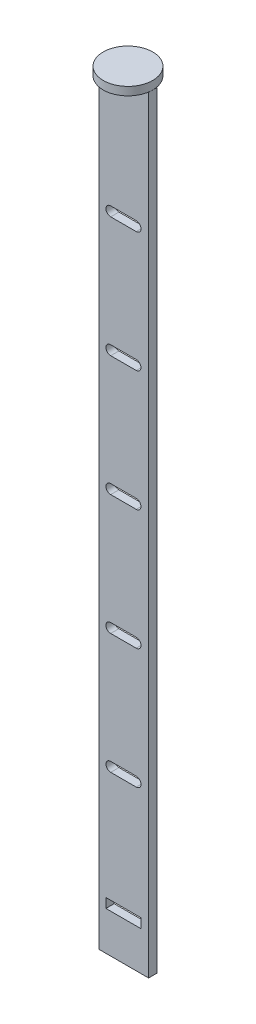
ISO-10303-21;
HEADER;
FILE_DESCRIPTION(('STEP AP214'),'2;1');
FILE_NAME('part.step','',(''),(''),'','','');
FILE_SCHEMA(('AUTOMOTIVE_DESIGN { 1 0 10303 214 1 1 1 1 }'));
ENDSEC;
DATA;
#1=APPLICATION_CONTEXT('core data for automotive mechanical design processes');
#2=APPLICATION_PROTOCOL_DEFINITION('international standard','automotive_design',2000,#1);
#3=PRODUCT_CONTEXT('',#1,'mechanical');
#4=PRODUCT('Part','Part','',(#3));
#5=PRODUCT_RELATED_PRODUCT_CATEGORY('part','',(#4));
#6=PRODUCT_DEFINITION_FORMATION('','',#4);
#7=PRODUCT_DEFINITION_CONTEXT('part definition',#1,'design');
#8=PRODUCT_DEFINITION('design','',#6,#7);
#9=PRODUCT_DEFINITION_SHAPE('','',#8);
#10=(LENGTH_UNIT() NAMED_UNIT(*) SI_UNIT(.MILLI.,.METRE.));
#11=(NAMED_UNIT(*) PLANE_ANGLE_UNIT() SI_UNIT($,.RADIAN.));
#12=(NAMED_UNIT(*) SI_UNIT($,.STERADIAN.) SOLID_ANGLE_UNIT());
#13=UNCERTAINTY_MEASURE_WITH_UNIT(LENGTH_MEASURE(1.E-05),#10,'distance_accuracy_value','');
#14=(GEOMETRIC_REPRESENTATION_CONTEXT(3) GLOBAL_UNCERTAINTY_ASSIGNED_CONTEXT((#13)) GLOBAL_UNIT_ASSIGNED_CONTEXT((#10,
#11,#12)) REPRESENTATION_CONTEXT('',''));
#15=CARTESIAN_POINT('',(0.,0.,0.));
#16=DIRECTION('',(0.,0.,1.));
#17=DIRECTION('',(1.,0.,0.));
#18=AXIS2_PLACEMENT_3D('',#15,#16,#17);
#19=CARTESIAN_POINT('',(29.,404.,498.));
#20=DIRECTION('',(0.,-1.,0.));
#21=DIRECTION('',(0.,0.,-1.));
#22=AXIS2_PLACEMENT_3D('',#19,#20,#21);
#23=CYLINDRICAL_SURFACE('',#22,12.);
#24=CARTESIAN_POINT('',(29.,404.,498.));
#25=DIRECTION('',(0.,1.,0.));
#26=DIRECTION('',(0.,0.,1.));
#27=AXIS2_PLACEMENT_3D('',#24,#25,#26);
#28=CIRCLE('',#27,12.);
#29=CARTESIAN_POINT('',(29.,404.,510.));
#30=VERTEX_POINT('',#29);
#31=EDGE_CURVE('E11',#30,#30,#28,.T.);
#32=ORIENTED_EDGE('',*,*,#31,.F.);
#33=EDGE_LOOP('',(#32));
#34=FACE_BOUND('',#33,.T.);
#35=CARTESIAN_POINT('',(29.,400.,498.));
#36=DIRECTION('',(0.,1.,0.));
#37=DIRECTION('',(0.,0.,1.));
#38=AXIS2_PLACEMENT_3D('',#35,#36,#37);
#39=CIRCLE('',#38,12.);
#40=CARTESIAN_POINT('',(29.,400.,510.));
#41=VERTEX_POINT('',#40);
#42=EDGE_CURVE('E52',#41,#41,#39,.T.);
#43=ORIENTED_EDGE('',*,*,#42,.T.);
#44=EDGE_LOOP('',(#43));
#45=FACE_BOUND('',#44,.T.);
#46=ADVANCED_FACE('F49',(#34,#45),#23,.T.);
#47=CARTESIAN_POINT('',(29.,404.,498.));
#48=DIRECTION('',(0.,1.,0.));
#49=DIRECTION('',(0.,0.,1.));
#50=AXIS2_PLACEMENT_3D('',#47,#48,#49);
#51=PLANE('',#50);
#52=ORIENTED_EDGE('',*,*,#31,.T.);
#53=EDGE_LOOP('',(#52));
#54=FACE_BOUND('',#53,.T.);
#55=ADVANCED_FACE('F64',(#54),#51,.T.);
#56=CARTESIAN_POINT('',(29.,400.,498.));
#57=DIRECTION('',(0.,1.,0.));
#58=DIRECTION('',(0.,0.,1.));
#59=AXIS2_PLACEMENT_3D('',#56,#57,#58);
#60=PLANE('',#59);
#61=ORIENTED_EDGE('',*,*,#42,.F.);
#62=EDGE_LOOP('',(#61));
#63=FACE_BOUND('',#62,.T.);
#64=ADVANCED_FACE('F62',(#63),#60,.F.);
#65=CLOSED_SHELL('',(#46,#55,#64));
#66=MANIFOLD_SOLID_BREP('B2',#65);
#67=CARTESIAN_POINT('',(41.,28.,500.));
#68=DIRECTION('',(0.,0.,-1.));
#69=DIRECTION('',(-1.,0.,0.));
#70=AXIS2_PLACEMENT_3D('',#67,#68,#69);
#71=PLANE('',#70);
#72=DIRECTION('',(-1.,0.,0.));
#73=VECTOR('',#72,1.);
#74=CARTESIAN_POINT('',(22.6047226650039,284.8,500.));
#75=LINE('',#74,#73);
#76=CARTESIAN_POINT('',(35.,284.8,500.));
#77=VERTEX_POINT('',#76);
#78=CARTESIAN_POINT('',(22.6047226650039,284.8,500.));
#79=VERTEX_POINT('',#78);
#80=EDGE_CURVE('E301',#77,#79,#75,.T.);
#81=ORIENTED_EDGE('',*,*,#80,.F.);
#82=CARTESIAN_POINT('',(35.,282.5,500.));
#83=DIRECTION('',(0.,0.,-1.));
#84=DIRECTION('',(-1.,0.,0.));
#85=AXIS2_PLACEMENT_3D('',#82,#83,#84);
#86=CIRCLE('',#85,2.3);
#87=CARTESIAN_POINT('',(35.,280.2,500.));
#88=VERTEX_POINT('',#87);
#89=EDGE_CURVE('E320',#88,#77,#86,.F.);
#90=ORIENTED_EDGE('',*,*,#89,.F.);
#91=DIRECTION('',(1.,0.,0.));
#92=VECTOR('',#91,1.);
#93=CARTESIAN_POINT('',(22.6047226650039,280.2,500.));
#94=LINE('',#93,#92);
#95=CARTESIAN_POINT('',(22.6047226650039,280.2,500.));
#96=VERTEX_POINT('',#95);
#97=EDGE_CURVE('E303',#96,#88,#94,.T.);
#98=ORIENTED_EDGE('',*,*,#97,.F.);
#99=CARTESIAN_POINT('',(22.604722665004,282.5,500.));
#100=DIRECTION('',(0.,0.,-1.));
#101=DIRECTION('',(-1.,0.,0.));
#102=AXIS2_PLACEMENT_3D('',#99,#100,#101);
#103=CIRCLE('',#102,2.3);
#104=EDGE_CURVE('E324',#79,#96,#103,.F.);
#105=ORIENTED_EDGE('',*,*,#104,.F.);
#106=EDGE_LOOP('',(#81,#90,#98,#105));
#107=FACE_BOUND('',#106,.T.);
#108=DIRECTION('',(-1.,0.,0.));
#109=VECTOR('',#108,1.);
#110=CARTESIAN_POINT('',(22.6047226650039,168.133333333333,500.));
#111=LINE('',#110,#109);
#112=CARTESIAN_POINT('',(35.,168.133333333333,500.));
#113=VERTEX_POINT('',#112);
#114=CARTESIAN_POINT('',(22.6047226650039,168.133333333333,500.));
#115=VERTEX_POINT('',#114);
#116=EDGE_CURVE('E353',#113,#115,#111,.T.);
#117=ORIENTED_EDGE('',*,*,#116,.F.);
#118=CARTESIAN_POINT('',(35.,165.833333333333,500.));
#119=DIRECTION('',(0.,0.,-1.));
#120=DIRECTION('',(-1.,0.,0.));
#121=AXIS2_PLACEMENT_3D('',#118,#119,#120);
#122=CIRCLE('',#121,2.3);
#123=CARTESIAN_POINT('',(35.,163.533333333333,500.));
#124=VERTEX_POINT('',#123);
#125=EDGE_CURVE('E372',#124,#113,#122,.F.);
#126=ORIENTED_EDGE('',*,*,#125,.F.);
#127=DIRECTION('',(1.,0.,0.));
#128=VECTOR('',#127,1.);
#129=CARTESIAN_POINT('',(22.6047226650039,163.533333333333,500.));
#130=LINE('',#129,#128);
#131=CARTESIAN_POINT('',(22.6047226650039,163.533333333333,500.));
#132=VERTEX_POINT('',#131);
#133=EDGE_CURVE('E355',#132,#124,#130,.T.);
#134=ORIENTED_EDGE('',*,*,#133,.F.);
#135=CARTESIAN_POINT('',(22.604722665004,165.833333333333,500.));
#136=DIRECTION('',(0.,0.,-1.));
#137=DIRECTION('',(-1.,0.,0.));
#138=AXIS2_PLACEMENT_3D('',#135,#136,#137);
#139=CIRCLE('',#138,2.3);
#140=EDGE_CURVE('E376',#115,#132,#139,.F.);
#141=ORIENTED_EDGE('',*,*,#140,.F.);
#142=EDGE_LOOP('',(#117,#126,#134,#141));
#143=FACE_BOUND('',#142,.T.);
#144=DIRECTION('',(0.,-1.,0.));
#145=VECTOR('',#144,1.);
#146=CARTESIAN_POINT('',(17.,28.,500.));
#147=LINE('',#146,#145);
#148=CARTESIAN_POINT('',(17.,400.,500.));
#149=VERTEX_POINT('',#148);
#150=CARTESIAN_POINT('',(17.,28.,500.));
#151=VERTEX_POINT('',#150);
#152=EDGE_CURVE('E425',#149,#151,#147,.T.);
#153=ORIENTED_EDGE('',*,*,#152,.T.);
#154=DIRECTION('',(-1.,0.,0.));
#155=VECTOR('',#154,1.);
#156=CARTESIAN_POINT('',(41.,28.,500.));
#157=LINE('',#156,#155);
#158=CARTESIAN_POINT('',(41.,28.,500.));
#159=VERTEX_POINT('',#158);
#160=EDGE_CURVE('E452',#159,#151,#157,.T.);
#161=ORIENTED_EDGE('',*,*,#160,.F.);
#162=DIRECTION('',(0.,-1.,0.));
#163=VECTOR('',#162,1.);
#164=CARTESIAN_POINT('',(41.,28.,500.));
#165=LINE('',#164,#163);
#166=CARTESIAN_POINT('',(41.,400.,500.));
#167=VERTEX_POINT('',#166);
#168=EDGE_CURVE('E426',#167,#159,#165,.T.);
#169=ORIENTED_EDGE('',*,*,#168,.F.);
#170=DIRECTION('',(-1.,0.,0.));
#171=VECTOR('',#170,1.);
#172=CARTESIAN_POINT('',(41.,400.,500.));
#173=LINE('',#172,#171);
#174=EDGE_CURVE('E436',#167,#149,#173,.T.);
#175=ORIENTED_EDGE('',*,*,#174,.T.);
#176=EDGE_LOOP('',(#153,#161,#169,#175));
#177=FACE_BOUND('',#176,.T.);
#178=DIRECTION('',(-1.,0.,0.));
#179=VECTOR('',#178,1.);
#180=CARTESIAN_POINT('',(41.,51.4666666666667,500.));
#181=LINE('',#180,#179);
#182=CARTESIAN_POINT('',(37.3,51.4666666666667,500.));
#183=VERTEX_POINT('',#182);
#184=CARTESIAN_POINT('',(20.304722665004,51.4666666666667,500.));
#185=VERTEX_POINT('',#184);
#186=EDGE_CURVE('E420',#183,#185,#181,.T.);
#187=ORIENTED_EDGE('',*,*,#186,.F.);
#188=DIRECTION('',(0.,-1.,0.));
#189=VECTOR('',#188,1.);
#190=CARTESIAN_POINT('',(37.3,28.,500.));
#191=LINE('',#190,#189);
#192=CARTESIAN_POINT('',(37.3,46.8666666666667,500.));
#193=VERTEX_POINT('',#192);
#194=EDGE_CURVE('E417',#183,#193,#191,.T.);
#195=ORIENTED_EDGE('',*,*,#194,.T.);
#196=DIRECTION('',(1.,0.,0.));
#197=VECTOR('',#196,1.);
#198=CARTESIAN_POINT('',(41.,46.8666666666667,500.));
#199=LINE('',#198,#197);
#200=CARTESIAN_POINT('',(20.304722665004,46.8666666666667,500.));
#201=VERTEX_POINT('',#200);
#202=EDGE_CURVE('E423',#201,#193,#199,.T.);
#203=ORIENTED_EDGE('',*,*,#202,.F.);
#204=DIRECTION('',(0.,-1.,0.));
#205=VECTOR('',#204,1.);
#206=CARTESIAN_POINT('',(20.304722665004,28.,500.));
#207=LINE('',#206,#205);
#208=EDGE_CURVE('E413',#185,#201,#207,.T.);
#209=ORIENTED_EDGE('',*,*,#208,.F.);
#210=EDGE_LOOP('',(#187,#195,#203,#209));
#211=FACE_BOUND('',#210,.T.);
#212=DIRECTION('',(-1.,0.,0.));
#213=VECTOR('',#212,1.);
#214=CARTESIAN_POINT('',(22.6047226650039,109.8,500.));
#215=LINE('',#214,#213);
#216=CARTESIAN_POINT('',(35.,109.8,500.));
#217=VERTEX_POINT('',#216);
#218=CARTESIAN_POINT('',(22.6047226650039,109.8,500.));
#219=VERTEX_POINT('',#218);
#220=EDGE_CURVE('E379',#217,#219,#215,.T.);
#221=ORIENTED_EDGE('',*,*,#220,.F.);
#222=CARTESIAN_POINT('',(35.,107.5,500.));
#223=DIRECTION('',(0.,0.,-1.));
#224=DIRECTION('',(-1.,0.,0.));
#225=AXIS2_PLACEMENT_3D('',#222,#223,#224);
#226=CIRCLE('',#225,2.3);
#227=CARTESIAN_POINT('',(35.,105.2,500.));
#228=VERTEX_POINT('',#227);
#229=EDGE_CURVE('E398',#228,#217,#226,.F.);
#230=ORIENTED_EDGE('',*,*,#229,.F.);
#231=DIRECTION('',(1.,0.,0.));
#232=VECTOR('',#231,1.);
#233=CARTESIAN_POINT('',(22.6047226650039,105.2,500.));
#234=LINE('',#233,#232);
#235=CARTESIAN_POINT('',(22.6047226650039,105.2,500.));
#236=VERTEX_POINT('',#235);
#237=EDGE_CURVE('E381',#236,#228,#234,.T.);
#238=ORIENTED_EDGE('',*,*,#237,.F.);
#239=CARTESIAN_POINT('',(22.604722665004,107.5,500.));
#240=DIRECTION('',(0.,0.,-1.));
#241=DIRECTION('',(-1.,0.,0.));
#242=AXIS2_PLACEMENT_3D('',#239,#240,#241);
#243=CIRCLE('',#242,2.3);
#244=EDGE_CURVE('E402',#219,#236,#243,.F.);
#245=ORIENTED_EDGE('',*,*,#244,.F.);
#246=EDGE_LOOP('',(#221,#230,#238,#245));
#247=FACE_BOUND('',#246,.T.);
#248=DIRECTION('',(-1.,0.,0.));
#249=VECTOR('',#248,1.);
#250=CARTESIAN_POINT('',(22.6047226650039,226.466666666667,500.));
#251=LINE('',#250,#249);
#252=CARTESIAN_POINT('',(35.,226.466666666667,500.));
#253=VERTEX_POINT('',#252);
#254=CARTESIAN_POINT('',(22.6047226650039,226.466666666667,500.));
#255=VERTEX_POINT('',#254);
#256=EDGE_CURVE('E327',#253,#255,#251,.T.);
#257=ORIENTED_EDGE('',*,*,#256,.F.);
#258=CARTESIAN_POINT('',(35.,224.166666666667,500.));
#259=DIRECTION('',(0.,0.,-1.));
#260=DIRECTION('',(-1.,0.,0.));
#261=AXIS2_PLACEMENT_3D('',#258,#259,#260);
#262=CIRCLE('',#261,2.3);
#263=CARTESIAN_POINT('',(35.,221.866666666667,500.));
#264=VERTEX_POINT('',#263);
#265=EDGE_CURVE('E346',#264,#253,#262,.F.);
#266=ORIENTED_EDGE('',*,*,#265,.F.);
#267=DIRECTION('',(1.,0.,0.));
#268=VECTOR('',#267,1.);
#269=CARTESIAN_POINT('',(22.6047226650039,221.866666666667,500.));
#270=LINE('',#269,#268);
#271=CARTESIAN_POINT('',(22.6047226650039,221.866666666667,500.));
#272=VERTEX_POINT('',#271);
#273=EDGE_CURVE('E329',#272,#264,#270,.T.);
#274=ORIENTED_EDGE('',*,*,#273,.F.);
#275=CARTESIAN_POINT('',(22.604722665004,224.166666666667,500.));
#276=DIRECTION('',(0.,0.,-1.));
#277=DIRECTION('',(-1.,0.,0.));
#278=AXIS2_PLACEMENT_3D('',#275,#276,#277);
#279=CIRCLE('',#278,2.3);
#280=EDGE_CURVE('E350',#255,#272,#279,.F.);
#281=ORIENTED_EDGE('',*,*,#280,.F.);
#282=EDGE_LOOP('',(#257,#266,#274,#281));
#283=FACE_BOUND('',#282,.T.);
#284=DIRECTION('',(-1.,0.,0.));
#285=VECTOR('',#284,1.);
#286=CARTESIAN_POINT('',(22.6047226650039,343.133333333333,500.));
#287=LINE('',#286,#285);
#288=CARTESIAN_POINT('',(35.,343.133333333333,500.));
#289=VERTEX_POINT('',#288);
#290=CARTESIAN_POINT('',(22.6047226650039,343.133333333333,500.));
#291=VERTEX_POINT('',#290);
#292=EDGE_CURVE('E276',#289,#291,#287,.T.);
#293=ORIENTED_EDGE('',*,*,#292,.F.);
#294=CARTESIAN_POINT('',(35.,340.833333333333,500.));
#295=DIRECTION('',(0.,0.,-1.));
#296=DIRECTION('',(-1.,0.,0.));
#297=AXIS2_PLACEMENT_3D('',#294,#295,#296);
#298=CIRCLE('',#297,2.3);
#299=CARTESIAN_POINT('',(35.,338.533333333333,500.));
#300=VERTEX_POINT('',#299);
#301=EDGE_CURVE('E288',#300,#289,#298,.F.);
#302=ORIENTED_EDGE('',*,*,#301,.F.);
#303=DIRECTION('',(1.,0.,0.));
#304=VECTOR('',#303,1.);
#305=CARTESIAN_POINT('',(22.6047226650039,338.533333333333,500.));
#306=LINE('',#305,#304);
#307=CARTESIAN_POINT('',(22.6047226650039,338.533333333333,500.));
#308=VERTEX_POINT('',#307);
#309=EDGE_CURVE('E106',#308,#300,#306,.T.);
#310=ORIENTED_EDGE('',*,*,#309,.F.);
#311=CARTESIAN_POINT('',(22.604722665004,340.833333333333,500.));
#312=DIRECTION('',(0.,0.,-1.));
#313=DIRECTION('',(-1.,0.,0.));
#314=AXIS2_PLACEMENT_3D('',#311,#312,#313);
#315=CIRCLE('',#314,2.3);
#316=EDGE_CURVE('E290',#291,#308,#315,.F.);
#317=ORIENTED_EDGE('',*,*,#316,.F.);
#318=EDGE_LOOP('',(#293,#302,#310,#317));
#319=FACE_BOUND('',#318,.T.);
#320=ADVANCED_FACE('F90',(#107,#143,#177,#211,#247,#283,#319),#71,.F.);
#321=CARTESIAN_POINT('',(41.,28.,496.));
#322=DIRECTION('',(0.,0.,1.));
#323=DIRECTION('',(1.,0.,0.));
#324=AXIS2_PLACEMENT_3D('',#321,#322,#323);
#325=PLANE('',#324);
#326=DIRECTION('',(1.,0.,0.));
#327=VECTOR('',#326,1.);
#328=CARTESIAN_POINT('',(41.,284.8,496.));
#329=LINE('',#328,#327);
#330=CARTESIAN_POINT('',(22.6047226650039,284.8,496.));
#331=VERTEX_POINT('',#330);
#332=CARTESIAN_POINT('',(35.,284.8,496.));
#333=VERTEX_POINT('',#332);
#334=EDGE_CURVE('E317',#331,#333,#329,.T.);
#335=ORIENTED_EDGE('',*,*,#334,.F.);
#336=CARTESIAN_POINT('',(22.604722665004,282.5,496.));
#337=DIRECTION('',(0.,0.,1.));
#338=DIRECTION('',(1.,0.,0.));
#339=AXIS2_PLACEMENT_3D('',#336,#337,#338);
#340=CIRCLE('',#339,2.3);
#341=CARTESIAN_POINT('',(22.6047226650039,280.2,496.));
#342=VERTEX_POINT('',#341);
#343=EDGE_CURVE('E323',#342,#331,#340,.F.);
#344=ORIENTED_EDGE('',*,*,#343,.F.);
#345=DIRECTION('',(-1.,0.,0.));
#346=VECTOR('',#345,1.);
#347=CARTESIAN_POINT('',(41.,280.2,496.));
#348=LINE('',#347,#346);
#349=CARTESIAN_POINT('',(35.,280.2,496.));
#350=VERTEX_POINT('',#349);
#351=EDGE_CURVE('E315',#350,#342,#348,.T.);
#352=ORIENTED_EDGE('',*,*,#351,.F.);
#353=CARTESIAN_POINT('',(35.,282.5,496.));
#354=DIRECTION('',(0.,0.,1.));
#355=DIRECTION('',(1.,0.,0.));
#356=AXIS2_PLACEMENT_3D('',#353,#354,#355);
#357=CIRCLE('',#356,2.3);
#358=EDGE_CURVE('E319',#333,#350,#357,.F.);
#359=ORIENTED_EDGE('',*,*,#358,.F.);
#360=EDGE_LOOP('',(#335,#344,#352,#359));
#361=FACE_BOUND('',#360,.T.);
#362=DIRECTION('',(1.,0.,0.));
#363=VECTOR('',#362,1.);
#364=CARTESIAN_POINT('',(41.,168.133333333333,496.));
#365=LINE('',#364,#363);
#366=CARTESIAN_POINT('',(22.6047226650039,168.133333333333,496.));
#367=VERTEX_POINT('',#366);
#368=CARTESIAN_POINT('',(35.,168.133333333333,496.));
#369=VERTEX_POINT('',#368);
#370=EDGE_CURVE('E369',#367,#369,#365,.T.);
#371=ORIENTED_EDGE('',*,*,#370,.F.);
#372=CARTESIAN_POINT('',(22.604722665004,165.833333333333,496.));
#373=DIRECTION('',(0.,0.,1.));
#374=DIRECTION('',(1.,0.,0.));
#375=AXIS2_PLACEMENT_3D('',#372,#373,#374);
#376=CIRCLE('',#375,2.3);
#377=CARTESIAN_POINT('',(22.6047226650039,163.533333333333,496.));
#378=VERTEX_POINT('',#377);
#379=EDGE_CURVE('E375',#378,#367,#376,.F.);
#380=ORIENTED_EDGE('',*,*,#379,.F.);
#381=DIRECTION('',(-1.,0.,0.));
#382=VECTOR('',#381,1.);
#383=CARTESIAN_POINT('',(41.,163.533333333333,496.));
#384=LINE('',#383,#382);
#385=CARTESIAN_POINT('',(35.,163.533333333333,496.));
#386=VERTEX_POINT('',#385);
#387=EDGE_CURVE('E367',#386,#378,#384,.T.);
#388=ORIENTED_EDGE('',*,*,#387,.F.);
#389=CARTESIAN_POINT('',(35.,165.833333333333,496.));
#390=DIRECTION('',(0.,0.,1.));
#391=DIRECTION('',(1.,0.,0.));
#392=AXIS2_PLACEMENT_3D('',#389,#390,#391);
#393=CIRCLE('',#392,2.3);
#394=EDGE_CURVE('E371',#369,#386,#393,.F.);
#395=ORIENTED_EDGE('',*,*,#394,.F.);
#396=EDGE_LOOP('',(#371,#380,#388,#395));
#397=FACE_BOUND('',#396,.T.);
#398=DIRECTION('',(0.,1.,0.));
#399=VECTOR('',#398,1.);
#400=CARTESIAN_POINT('',(17.,28.,496.));
#401=LINE('',#400,#399);
#402=CARTESIAN_POINT('',(17.,28.,496.));
#403=VERTEX_POINT('',#402);
#404=CARTESIAN_POINT('',(17.,400.,496.));
#405=VERTEX_POINT('',#404);
#406=EDGE_CURVE('E441',#403,#405,#401,.T.);
#407=ORIENTED_EDGE('',*,*,#406,.T.);
#408=DIRECTION('',(-1.,0.,0.));
#409=VECTOR('',#408,1.);
#410=CARTESIAN_POINT('',(41.,400.,496.));
#411=LINE('',#410,#409);
#412=CARTESIAN_POINT('',(41.,400.,496.));
#413=VERTEX_POINT('',#412);
#414=EDGE_CURVE('E446',#413,#405,#411,.T.);
#415=ORIENTED_EDGE('',*,*,#414,.F.);
#416=DIRECTION('',(0.,1.,0.));
#417=VECTOR('',#416,1.);
#418=CARTESIAN_POINT('',(41.,28.,496.));
#419=LINE('',#418,#417);
#420=CARTESIAN_POINT('',(41.,28.,496.));
#421=VERTEX_POINT('',#420);
#422=EDGE_CURVE('E432',#421,#413,#419,.T.);
#423=ORIENTED_EDGE('',*,*,#422,.F.);
#424=DIRECTION('',(-1.,0.,0.));
#425=VECTOR('',#424,1.);
#426=CARTESIAN_POINT('',(41.,28.,496.));
#427=LINE('',#426,#425);
#428=EDGE_CURVE('E449',#421,#403,#427,.T.);
#429=ORIENTED_EDGE('',*,*,#428,.T.);
#430=EDGE_LOOP('',(#407,#415,#423,#429));
#431=FACE_BOUND('',#430,.T.);
#432=DIRECTION('',(-1.,0.,0.));
#433=VECTOR('',#432,1.);
#434=CARTESIAN_POINT('',(41.,46.8666666666667,496.));
#435=LINE('',#434,#433);
#436=CARTESIAN_POINT('',(37.3,46.8666666666667,496.));
#437=VERTEX_POINT('',#436);
#438=CARTESIAN_POINT('',(20.304722665004,46.8666666666667,496.));
#439=VERTEX_POINT('',#438);
#440=EDGE_CURVE('E98',#437,#439,#435,.T.);
#441=ORIENTED_EDGE('',*,*,#440,.F.);
#442=DIRECTION('',(0.,1.,0.));
#443=VECTOR('',#442,1.);
#444=CARTESIAN_POINT('',(37.3,28.,496.));
#445=LINE('',#444,#443);
#446=CARTESIAN_POINT('',(37.3,51.4666666666667,496.));
#447=VERTEX_POINT('',#446);
#448=EDGE_CURVE('E47',#437,#447,#445,.T.);
#449=ORIENTED_EDGE('',*,*,#448,.T.);
#450=DIRECTION('',(1.,0.,0.));
#451=VECTOR('',#450,1.);
#452=CARTESIAN_POINT('',(41.,51.4666666666667,496.));
#453=LINE('',#452,#451);
#454=CARTESIAN_POINT('',(20.304722665004,51.4666666666667,496.));
#455=VERTEX_POINT('',#454);
#456=EDGE_CURVE('E457',#455,#447,#453,.T.);
#457=ORIENTED_EDGE('',*,*,#456,.F.);
#458=DIRECTION('',(0.,1.,0.));
#459=VECTOR('',#458,1.);
#460=CARTESIAN_POINT('',(20.304722665004,28.,496.));
#461=LINE('',#460,#459);
#462=EDGE_CURVE('E455',#439,#455,#461,.T.);
#463=ORIENTED_EDGE('',*,*,#462,.F.);
#464=EDGE_LOOP('',(#441,#449,#457,#463));
#465=FACE_BOUND('',#464,.T.);
#466=DIRECTION('',(1.,0.,0.));
#467=VECTOR('',#466,1.);
#468=CARTESIAN_POINT('',(41.,109.8,496.));
#469=LINE('',#468,#467);
#470=CARTESIAN_POINT('',(22.6047226650039,109.8,496.));
#471=VERTEX_POINT('',#470);
#472=CARTESIAN_POINT('',(35.,109.8,496.));
#473=VERTEX_POINT('',#472);
#474=EDGE_CURVE('E395',#471,#473,#469,.T.);
#475=ORIENTED_EDGE('',*,*,#474,.F.);
#476=CARTESIAN_POINT('',(22.604722665004,107.5,496.));
#477=DIRECTION('',(0.,0.,1.));
#478=DIRECTION('',(1.,0.,0.));
#479=AXIS2_PLACEMENT_3D('',#476,#477,#478);
#480=CIRCLE('',#479,2.3);
#481=CARTESIAN_POINT('',(22.6047226650039,105.2,496.));
#482=VERTEX_POINT('',#481);
#483=EDGE_CURVE('E401',#482,#471,#480,.F.);
#484=ORIENTED_EDGE('',*,*,#483,.F.);
#485=DIRECTION('',(-1.,0.,0.));
#486=VECTOR('',#485,1.);
#487=CARTESIAN_POINT('',(41.,105.2,496.));
#488=LINE('',#487,#486);
#489=CARTESIAN_POINT('',(35.,105.2,496.));
#490=VERTEX_POINT('',#489);
#491=EDGE_CURVE('E393',#490,#482,#488,.T.);
#492=ORIENTED_EDGE('',*,*,#491,.F.);
#493=CARTESIAN_POINT('',(35.,107.5,496.));
#494=DIRECTION('',(0.,0.,1.));
#495=DIRECTION('',(1.,0.,0.));
#496=AXIS2_PLACEMENT_3D('',#493,#494,#495);
#497=CIRCLE('',#496,2.3);
#498=EDGE_CURVE('E397',#473,#490,#497,.F.);
#499=ORIENTED_EDGE('',*,*,#498,.F.);
#500=EDGE_LOOP('',(#475,#484,#492,#499));
#501=FACE_BOUND('',#500,.T.);
#502=DIRECTION('',(1.,0.,0.));
#503=VECTOR('',#502,1.);
#504=CARTESIAN_POINT('',(41.,226.466666666667,496.));
#505=LINE('',#504,#503);
#506=CARTESIAN_POINT('',(22.6047226650039,226.466666666667,496.));
#507=VERTEX_POINT('',#506);
#508=CARTESIAN_POINT('',(35.,226.466666666667,496.));
#509=VERTEX_POINT('',#508);
#510=EDGE_CURVE('E343',#507,#509,#505,.T.);
#511=ORIENTED_EDGE('',*,*,#510,.F.);
#512=CARTESIAN_POINT('',(22.604722665004,224.166666666667,496.));
#513=DIRECTION('',(0.,0.,1.));
#514=DIRECTION('',(1.,0.,0.));
#515=AXIS2_PLACEMENT_3D('',#512,#513,#514);
#516=CIRCLE('',#515,2.3);
#517=CARTESIAN_POINT('',(22.6047226650039,221.866666666667,496.));
#518=VERTEX_POINT('',#517);
#519=EDGE_CURVE('E349',#518,#507,#516,.F.);
#520=ORIENTED_EDGE('',*,*,#519,.F.);
#521=DIRECTION('',(-1.,0.,0.));
#522=VECTOR('',#521,1.);
#523=CARTESIAN_POINT('',(41.,221.866666666667,496.));
#524=LINE('',#523,#522);
#525=CARTESIAN_POINT('',(35.,221.866666666667,496.));
#526=VERTEX_POINT('',#525);
#527=EDGE_CURVE('E341',#526,#518,#524,.T.);
#528=ORIENTED_EDGE('',*,*,#527,.F.);
#529=CARTESIAN_POINT('',(35.,224.166666666667,496.));
#530=DIRECTION('',(0.,0.,1.));
#531=DIRECTION('',(1.,0.,0.));
#532=AXIS2_PLACEMENT_3D('',#529,#530,#531);
#533=CIRCLE('',#532,2.3);
#534=EDGE_CURVE('E345',#509,#526,#533,.F.);
#535=ORIENTED_EDGE('',*,*,#534,.F.);
#536=EDGE_LOOP('',(#511,#520,#528,#535));
#537=FACE_BOUND('',#536,.T.);
#538=DIRECTION('',(1.,0.,0.));
#539=VECTOR('',#538,1.);
#540=CARTESIAN_POINT('',(41.,343.133333333333,496.));
#541=LINE('',#540,#539);
#542=CARTESIAN_POINT('',(22.6047226650039,343.133333333333,496.));
#543=VERTEX_POINT('',#542);
#544=CARTESIAN_POINT('',(35.,343.133333333333,496.));
#545=VERTEX_POINT('',#544);
#546=EDGE_CURVE('E114',#543,#545,#541,.T.);
#547=ORIENTED_EDGE('',*,*,#546,.F.);
#548=CARTESIAN_POINT('',(22.604722665004,340.833333333333,496.));
#549=DIRECTION('',(0.,0.,1.));
#550=DIRECTION('',(1.,0.,0.));
#551=AXIS2_PLACEMENT_3D('',#548,#549,#550);
#552=CIRCLE('',#551,2.3);
#553=CARTESIAN_POINT('',(22.6047226650039,338.533333333333,496.));
#554=VERTEX_POINT('',#553);
#555=EDGE_CURVE('E294',#554,#543,#552,.F.);
#556=ORIENTED_EDGE('',*,*,#555,.F.);
#557=DIRECTION('',(-1.,0.,0.));
#558=VECTOR('',#557,1.);
#559=CARTESIAN_POINT('',(41.,338.533333333333,496.));
#560=LINE('',#559,#558);
#561=CARTESIAN_POINT('',(35.,338.533333333333,496.));
#562=VERTEX_POINT('',#561);
#563=EDGE_CURVE('E282',#562,#554,#560,.T.);
#564=ORIENTED_EDGE('',*,*,#563,.F.);
#565=CARTESIAN_POINT('',(35.,340.833333333333,496.));
#566=DIRECTION('',(0.,0.,1.));
#567=DIRECTION('',(1.,0.,0.));
#568=AXIS2_PLACEMENT_3D('',#565,#566,#567);
#569=CIRCLE('',#568,2.3);
#570=EDGE_CURVE('E93',#545,#562,#569,.F.);
#571=ORIENTED_EDGE('',*,*,#570,.F.);
#572=EDGE_LOOP('',(#547,#556,#564,#571));
#573=FACE_BOUND('',#572,.T.);
#574=ADVANCED_FACE('F484',(#361,#397,#431,#465,#501,#537,#573),#325,.F.);
#575=CARTESIAN_POINT('',(22.604722665004,340.833333333333,501.));
#576=DIRECTION('',(0.,0.,-1.));
#577=DIRECTION('',(-1.,0.,0.));
#578=AXIS2_PLACEMENT_3D('',#575,#576,#577);
#579=CYLINDRICAL_SURFACE('',#578,2.3);
#580=ORIENTED_EDGE('',*,*,#555,.T.);
#581=DIRECTION('',(0.,0.,-1.));
#582=VECTOR('',#581,1.);
#583=CARTESIAN_POINT('',(22.6047226650039,343.133333333333,496.));
#584=LINE('',#583,#582);
#585=EDGE_CURVE('E283',#291,#543,#584,.T.);
#586=ORIENTED_EDGE('',*,*,#585,.F.);
#587=ORIENTED_EDGE('',*,*,#316,.T.);
#588=DIRECTION('',(0.,0.,-1.));
#589=VECTOR('',#588,1.);
#590=CARTESIAN_POINT('',(22.6047226650039,338.533333333333,496.));
#591=LINE('',#590,#589);
#592=EDGE_CURVE('E846',#308,#554,#591,.T.);
#593=ORIENTED_EDGE('',*,*,#592,.T.);
#594=EDGE_LOOP('',(#580,#586,#587,#593));
#595=FACE_BOUND('',#594,.T.);
#596=ADVANCED_FACE('F517',(#595),#579,.F.);
#597=CARTESIAN_POINT('',(35.,340.833333333333,501.));
#598=DIRECTION('',(0.,0.,-1.));
#599=DIRECTION('',(-1.,0.,0.));
#600=AXIS2_PLACEMENT_3D('',#597,#598,#599);
#601=CYLINDRICAL_SURFACE('',#600,2.3);
#602=ORIENTED_EDGE('',*,*,#301,.T.);
#603=DIRECTION('',(0.,0.,-1.));
#604=VECTOR('',#603,1.);
#605=CARTESIAN_POINT('',(35.,343.133333333333,496.));
#606=LINE('',#605,#604);
#607=EDGE_CURVE('E273',#289,#545,#606,.T.);
#608=ORIENTED_EDGE('',*,*,#607,.T.);
#609=ORIENTED_EDGE('',*,*,#570,.T.);
#610=DIRECTION('',(0.,0.,-1.));
#611=VECTOR('',#610,1.);
#612=CARTESIAN_POINT('',(35.,338.533333333333,496.));
#613=LINE('',#612,#611);
#614=EDGE_CURVE('E293',#300,#562,#613,.T.);
#615=ORIENTED_EDGE('',*,*,#614,.F.);
#616=EDGE_LOOP('',(#602,#608,#609,#615));
#617=FACE_BOUND('',#616,.T.);
#618=ADVANCED_FACE('F292',(#617),#601,.F.);
#619=CARTESIAN_POINT('',(22.604722665004,282.5,501.));
#620=DIRECTION('',(0.,0.,-1.));
#621=DIRECTION('',(-1.,0.,0.));
#622=AXIS2_PLACEMENT_3D('',#619,#620,#621);
#623=CYLINDRICAL_SURFACE('',#622,2.3);
#624=ORIENTED_EDGE('',*,*,#343,.T.);
#625=DIRECTION('',(0.,0.,-1.));
#626=VECTOR('',#625,1.);
#627=CARTESIAN_POINT('',(22.6047226650039,284.8,496.));
#628=LINE('',#627,#626);
#629=EDGE_CURVE('E310',#79,#331,#628,.T.);
#630=ORIENTED_EDGE('',*,*,#629,.F.);
#631=ORIENTED_EDGE('',*,*,#104,.T.);
#632=DIRECTION('',(0.,0.,-1.));
#633=VECTOR('',#632,1.);
#634=CARTESIAN_POINT('',(22.6047226650039,280.2,496.));
#635=LINE('',#634,#633);
#636=EDGE_CURVE('E307',#96,#342,#635,.T.);
#637=ORIENTED_EDGE('',*,*,#636,.T.);
#638=EDGE_LOOP('',(#624,#630,#631,#637));
#639=FACE_BOUND('',#638,.T.);
#640=ADVANCED_FACE('F491',(#639),#623,.F.);
#641=CARTESIAN_POINT('',(35.,282.5,501.));
#642=DIRECTION('',(0.,0.,-1.));
#643=DIRECTION('',(-1.,0.,0.));
#644=AXIS2_PLACEMENT_3D('',#641,#642,#643);
#645=CYLINDRICAL_SURFACE('',#644,2.3);
#646=ORIENTED_EDGE('',*,*,#89,.T.);
#647=DIRECTION('',(0.,0.,-1.));
#648=VECTOR('',#647,1.);
#649=CARTESIAN_POINT('',(35.,284.8,496.));
#650=LINE('',#649,#648);
#651=EDGE_CURVE('E312',#77,#333,#650,.T.);
#652=ORIENTED_EDGE('',*,*,#651,.T.);
#653=ORIENTED_EDGE('',*,*,#358,.T.);
#654=DIRECTION('',(0.,0.,-1.));
#655=VECTOR('',#654,1.);
#656=CARTESIAN_POINT('',(35.,280.2,496.));
#657=LINE('',#656,#655);
#658=EDGE_CURVE('E305',#88,#350,#657,.T.);
#659=ORIENTED_EDGE('',*,*,#658,.F.);
#660=EDGE_LOOP('',(#646,#652,#653,#659));
#661=FACE_BOUND('',#660,.T.);
#662=ADVANCED_FACE('F479',(#661),#645,.F.);
#663=CARTESIAN_POINT('',(22.604722665004,224.166666666667,501.));
#664=DIRECTION('',(0.,0.,-1.));
#665=DIRECTION('',(-1.,0.,0.));
#666=AXIS2_PLACEMENT_3D('',#663,#664,#665);
#667=CYLINDRICAL_SURFACE('',#666,2.3);
#668=ORIENTED_EDGE('',*,*,#519,.T.);
#669=DIRECTION('',(0.,0.,-1.));
#670=VECTOR('',#669,1.);
#671=CARTESIAN_POINT('',(22.6047226650039,226.466666666667,496.));
#672=LINE('',#671,#670);
#673=EDGE_CURVE('E336',#255,#507,#672,.T.);
#674=ORIENTED_EDGE('',*,*,#673,.F.);
#675=ORIENTED_EDGE('',*,*,#280,.T.);
#676=DIRECTION('',(0.,0.,-1.));
#677=VECTOR('',#676,1.);
#678=CARTESIAN_POINT('',(22.6047226650039,221.866666666667,496.));
#679=LINE('',#678,#677);
#680=EDGE_CURVE('E333',#272,#518,#679,.T.);
#681=ORIENTED_EDGE('',*,*,#680,.T.);
#682=EDGE_LOOP('',(#668,#674,#675,#681));
#683=FACE_BOUND('',#682,.T.);
#684=ADVANCED_FACE('F610',(#683),#667,.F.);
#685=CARTESIAN_POINT('',(35.,224.166666666667,501.));
#686=DIRECTION('',(0.,0.,-1.));
#687=DIRECTION('',(-1.,0.,0.));
#688=AXIS2_PLACEMENT_3D('',#685,#686,#687);
#689=CYLINDRICAL_SURFACE('',#688,2.3);
#690=ORIENTED_EDGE('',*,*,#265,.T.);
#691=DIRECTION('',(0.,0.,-1.));
#692=VECTOR('',#691,1.);
#693=CARTESIAN_POINT('',(35.,226.466666666667,496.));
#694=LINE('',#693,#692);
#695=EDGE_CURVE('E338',#253,#509,#694,.T.);
#696=ORIENTED_EDGE('',*,*,#695,.T.);
#697=ORIENTED_EDGE('',*,*,#534,.T.);
#698=DIRECTION('',(0.,0.,-1.));
#699=VECTOR('',#698,1.);
#700=CARTESIAN_POINT('',(35.,221.866666666667,496.));
#701=LINE('',#700,#699);
#702=EDGE_CURVE('E331',#264,#526,#701,.T.);
#703=ORIENTED_EDGE('',*,*,#702,.F.);
#704=EDGE_LOOP('',(#690,#696,#697,#703));
#705=FACE_BOUND('',#704,.T.);
#706=ADVANCED_FACE('F597',(#705),#689,.F.);
#707=CARTESIAN_POINT('',(22.604722665004,165.833333333333,501.));
#708=DIRECTION('',(0.,0.,-1.));
#709=DIRECTION('',(-1.,0.,0.));
#710=AXIS2_PLACEMENT_3D('',#707,#708,#709);
#711=CYLINDRICAL_SURFACE('',#710,2.3);
#712=ORIENTED_EDGE('',*,*,#379,.T.);
#713=DIRECTION('',(0.,0.,-1.));
#714=VECTOR('',#713,1.);
#715=CARTESIAN_POINT('',(22.6047226650039,168.133333333333,496.));
#716=LINE('',#715,#714);
#717=EDGE_CURVE('E362',#115,#367,#716,.T.);
#718=ORIENTED_EDGE('',*,*,#717,.F.);
#719=ORIENTED_EDGE('',*,*,#140,.T.);
#720=DIRECTION('',(0.,0.,-1.));
#721=VECTOR('',#720,1.);
#722=CARTESIAN_POINT('',(22.6047226650039,163.533333333333,496.));
#723=LINE('',#722,#721);
#724=EDGE_CURVE('E359',#132,#378,#723,.T.);
#725=ORIENTED_EDGE('',*,*,#724,.T.);
#726=EDGE_LOOP('',(#712,#718,#719,#725));
#727=FACE_BOUND('',#726,.T.);
#728=ADVANCED_FACE('F594',(#727),#711,.F.);
#729=CARTESIAN_POINT('',(35.,165.833333333333,501.));
#730=DIRECTION('',(0.,0.,-1.));
#731=DIRECTION('',(-1.,0.,0.));
#732=AXIS2_PLACEMENT_3D('',#729,#730,#731);
#733=CYLINDRICAL_SURFACE('',#732,2.3);
#734=ORIENTED_EDGE('',*,*,#125,.T.);
#735=DIRECTION('',(0.,0.,-1.));
#736=VECTOR('',#735,1.);
#737=CARTESIAN_POINT('',(35.,168.133333333333,496.));
#738=LINE('',#737,#736);
#739=EDGE_CURVE('E364',#113,#369,#738,.T.);
#740=ORIENTED_EDGE('',*,*,#739,.T.);
#741=ORIENTED_EDGE('',*,*,#394,.T.);
#742=DIRECTION('',(0.,0.,-1.));
#743=VECTOR('',#742,1.);
#744=CARTESIAN_POINT('',(35.,163.533333333333,496.));
#745=LINE('',#744,#743);
#746=EDGE_CURVE('E357',#124,#386,#745,.T.);
#747=ORIENTED_EDGE('',*,*,#746,.F.);
#748=EDGE_LOOP('',(#734,#740,#741,#747));
#749=FACE_BOUND('',#748,.T.);
#750=ADVANCED_FACE('F583',(#749),#733,.F.);
#751=CARTESIAN_POINT('',(22.604722665004,107.5,501.));
#752=DIRECTION('',(0.,0.,-1.));
#753=DIRECTION('',(-1.,0.,0.));
#754=AXIS2_PLACEMENT_3D('',#751,#752,#753);
#755=CYLINDRICAL_SURFACE('',#754,2.3);
#756=ORIENTED_EDGE('',*,*,#483,.T.);
#757=DIRECTION('',(0.,0.,-1.));
#758=VECTOR('',#757,1.);
#759=CARTESIAN_POINT('',(22.6047226650039,109.8,496.));
#760=LINE('',#759,#758);
#761=EDGE_CURVE('E388',#219,#471,#760,.T.);
#762=ORIENTED_EDGE('',*,*,#761,.F.);
#763=ORIENTED_EDGE('',*,*,#244,.T.);
#764=DIRECTION('',(0.,0.,-1.));
#765=VECTOR('',#764,1.);
#766=CARTESIAN_POINT('',(22.6047226650039,105.2,496.));
#767=LINE('',#766,#765);
#768=EDGE_CURVE('E385',#236,#482,#767,.T.);
#769=ORIENTED_EDGE('',*,*,#768,.T.);
#770=EDGE_LOOP('',(#756,#762,#763,#769));
#771=FACE_BOUND('',#770,.T.);
#772=ADVANCED_FACE('F538',(#771),#755,.F.);
#773=CARTESIAN_POINT('',(35.,107.5,501.));
#774=DIRECTION('',(0.,0.,-1.));
#775=DIRECTION('',(-1.,0.,0.));
#776=AXIS2_PLACEMENT_3D('',#773,#774,#775);
#777=CYLINDRICAL_SURFACE('',#776,2.3);
#778=ORIENTED_EDGE('',*,*,#229,.T.);
#779=DIRECTION('',(0.,0.,-1.));
#780=VECTOR('',#779,1.);
#781=CARTESIAN_POINT('',(35.,109.8,496.));
#782=LINE('',#781,#780);
#783=EDGE_CURVE('E390',#217,#473,#782,.T.);
#784=ORIENTED_EDGE('',*,*,#783,.T.);
#785=ORIENTED_EDGE('',*,*,#498,.T.);
#786=DIRECTION('',(0.,0.,-1.));
#787=VECTOR('',#786,1.);
#788=CARTESIAN_POINT('',(35.,105.2,496.));
#789=LINE('',#788,#787);
#790=EDGE_CURVE('E383',#228,#490,#789,.T.);
#791=ORIENTED_EDGE('',*,*,#790,.F.);
#792=EDGE_LOOP('',(#778,#784,#785,#791));
#793=FACE_BOUND('',#792,.T.);
#794=ADVANCED_FACE('F529',(#793),#777,.F.);
#795=CARTESIAN_POINT('',(41.,28.,496.));
#796=DIRECTION('',(0.,1.,0.));
#797=DIRECTION('',(0.,0.,1.));
#798=AXIS2_PLACEMENT_3D('',#795,#796,#797);
#799=PLANE('',#798);
#800=DIRECTION('',(0.,0.,-1.));
#801=VECTOR('',#800,1.);
#802=CARTESIAN_POINT('',(17.,28.,496.));
#803=LINE('',#802,#801);
#804=EDGE_CURVE('E439',#151,#403,#803,.T.);
#805=ORIENTED_EDGE('',*,*,#804,.T.);
#806=ORIENTED_EDGE('',*,*,#428,.F.);
#807=DIRECTION('',(0.,0.,-1.));
#808=VECTOR('',#807,1.);
#809=CARTESIAN_POINT('',(41.,28.,496.));
#810=LINE('',#809,#808);
#811=EDGE_CURVE('E429',#159,#421,#810,.T.);
#812=ORIENTED_EDGE('',*,*,#811,.F.);
#813=ORIENTED_EDGE('',*,*,#160,.T.);
#814=EDGE_LOOP('',(#805,#806,#812,#813));
#815=FACE_BOUND('',#814,.T.);
#816=ADVANCED_FACE('F527',(#815),#799,.F.);
#817=CARTESIAN_POINT('',(41.,400.,496.));
#818=DIRECTION('',(0.,-1.,0.));
#819=DIRECTION('',(0.,0.,-1.));
#820=AXIS2_PLACEMENT_3D('',#817,#818,#819);
#821=PLANE('',#820);
#822=DIRECTION('',(0.,0.,1.));
#823=VECTOR('',#822,1.);
#824=CARTESIAN_POINT('',(17.,400.,496.));
#825=LINE('',#824,#823);
#826=EDGE_CURVE('E430',#405,#149,#825,.T.);
#827=ORIENTED_EDGE('',*,*,#826,.T.);
#828=ORIENTED_EDGE('',*,*,#174,.F.);
#829=DIRECTION('',(0.,0.,1.));
#830=VECTOR('',#829,1.);
#831=CARTESIAN_POINT('',(41.,400.,496.));
#832=LINE('',#831,#830);
#833=EDGE_CURVE('E434',#413,#167,#832,.T.);
#834=ORIENTED_EDGE('',*,*,#833,.F.);
#835=ORIENTED_EDGE('',*,*,#414,.T.);
#836=EDGE_LOOP('',(#827,#828,#834,#835));
#837=FACE_BOUND('',#836,.T.);
#838=ADVANCED_FACE('F525',(#837),#821,.F.);
#839=CARTESIAN_POINT('',(41.,0.,0.));
#840=DIRECTION('',(1.,0.,0.));
#841=DIRECTION('',(0.,0.,-1.));
#842=AXIS2_PLACEMENT_3D('',#839,#840,#841);
#843=PLANE('',#842);
#844=ORIENTED_EDGE('',*,*,#168,.T.);
#845=ORIENTED_EDGE('',*,*,#811,.T.);
#846=ORIENTED_EDGE('',*,*,#422,.T.);
#847=ORIENTED_EDGE('',*,*,#833,.T.);
#848=EDGE_LOOP('',(#844,#845,#846,#847));
#849=FACE_BOUND('',#848,.T.);
#850=ADVANCED_FACE('F535',(#849),#843,.T.);
#851=CARTESIAN_POINT('',(17.,0.,0.));
#852=DIRECTION('',(1.,0.,0.));
#853=DIRECTION('',(0.,0.,-1.));
#854=AXIS2_PLACEMENT_3D('',#851,#852,#853);
#855=PLANE('',#854);
#856=ORIENTED_EDGE('',*,*,#152,.F.);
#857=ORIENTED_EDGE('',*,*,#826,.F.);
#858=ORIENTED_EDGE('',*,*,#406,.F.);
#859=ORIENTED_EDGE('',*,*,#804,.F.);
#860=EDGE_LOOP('',(#856,#857,#858,#859));
#861=FACE_BOUND('',#860,.T.);
#862=ADVANCED_FACE('F551',(#861),#855,.F.);
#863=CARTESIAN_POINT('',(37.3,46.8666666666667,495.));
#864=DIRECTION('',(0.,1.,0.));
#865=DIRECTION('',(0.,0.,1.));
#866=AXIS2_PLACEMENT_3D('',#863,#864,#865);
#867=PLANE('',#866);
#868=ORIENTED_EDGE('',*,*,#202,.T.);
#869=DIRECTION('',(0.,0.,-1.));
#870=VECTOR('',#869,1.);
#871=CARTESIAN_POINT('',(37.3,46.8666666666667,495.));
#872=LINE('',#871,#870);
#873=EDGE_CURVE('E406',#193,#437,#872,.T.);
#874=ORIENTED_EDGE('',*,*,#873,.T.);
#875=ORIENTED_EDGE('',*,*,#440,.T.);
#876=DIRECTION('',(0.,0.,-1.));
#877=VECTOR('',#876,1.);
#878=CARTESIAN_POINT('',(20.304722665004,46.8666666666667,495.));
#879=LINE('',#878,#877);
#880=EDGE_CURVE('E405',#201,#439,#879,.T.);
#881=ORIENTED_EDGE('',*,*,#880,.F.);
#882=EDGE_LOOP('',(#868,#874,#875,#881));
#883=FACE_BOUND('',#882,.T.);
#884=ADVANCED_FACE('F564',(#883),#867,.T.);
#885=CARTESIAN_POINT('',(37.3,51.4666666666667,495.));
#886=DIRECTION('',(0.,-1.,0.));
#887=DIRECTION('',(0.,0.,-1.));
#888=AXIS2_PLACEMENT_3D('',#885,#886,#887);
#889=PLANE('',#888);
#890=ORIENTED_EDGE('',*,*,#186,.T.);
#891=DIRECTION('',(0.,0.,1.));
#892=VECTOR('',#891,1.);
#893=CARTESIAN_POINT('',(20.304722665004,51.4666666666667,495.));
#894=LINE('',#893,#892);
#895=EDGE_CURVE('E410',#455,#185,#894,.T.);
#896=ORIENTED_EDGE('',*,*,#895,.F.);
#897=ORIENTED_EDGE('',*,*,#456,.T.);
#898=DIRECTION('',(0.,0.,1.));
#899=VECTOR('',#898,1.);
#900=CARTESIAN_POINT('',(37.3,51.4666666666667,495.));
#901=LINE('',#900,#899);
#902=EDGE_CURVE('E409',#447,#183,#901,.T.);
#903=ORIENTED_EDGE('',*,*,#902,.T.);
#904=EDGE_LOOP('',(#890,#896,#897,#903));
#905=FACE_BOUND('',#904,.T.);
#906=ADVANCED_FACE('F568',(#905),#889,.T.);
#907=CARTESIAN_POINT('',(37.3,0.,0.));
#908=DIRECTION('',(1.,0.,0.));
#909=DIRECTION('',(0.,0.,-1.));
#910=AXIS2_PLACEMENT_3D('',#907,#908,#909);
#911=PLANE('',#910);
#912=ORIENTED_EDGE('',*,*,#902,.F.);
#913=ORIENTED_EDGE('',*,*,#448,.F.);
#914=ORIENTED_EDGE('',*,*,#873,.F.);
#915=ORIENTED_EDGE('',*,*,#194,.F.);
#916=EDGE_LOOP('',(#912,#913,#914,#915));
#917=FACE_BOUND('',#916,.T.);
#918=ADVANCED_FACE('F572',(#917),#911,.F.);
#919=CARTESIAN_POINT('',(20.304722665004,0.,0.));
#920=DIRECTION('',(1.,0.,0.));
#921=DIRECTION('',(0.,0.,-1.));
#922=AXIS2_PLACEMENT_3D('',#919,#920,#921);
#923=PLANE('',#922);
#924=ORIENTED_EDGE('',*,*,#208,.T.);
#925=ORIENTED_EDGE('',*,*,#880,.T.);
#926=ORIENTED_EDGE('',*,*,#462,.T.);
#927=ORIENTED_EDGE('',*,*,#895,.T.);
#928=EDGE_LOOP('',(#924,#925,#926,#927));
#929=FACE_BOUND('',#928,.T.);
#930=ADVANCED_FACE('F574',(#929),#923,.T.);
#931=CARTESIAN_POINT('',(22.6047226650039,105.2,496.));
#932=DIRECTION('',(0.,1.,0.));
#933=DIRECTION('',(0.,0.,1.));
#934=AXIS2_PLACEMENT_3D('',#931,#932,#933);
#935=PLANE('',#934);
#936=ORIENTED_EDGE('',*,*,#491,.T.);
#937=ORIENTED_EDGE('',*,*,#768,.F.);
#938=ORIENTED_EDGE('',*,*,#237,.T.);
#939=ORIENTED_EDGE('',*,*,#790,.T.);
#940=EDGE_LOOP('',(#936,#937,#938,#939));
#941=FACE_BOUND('',#940,.T.);
#942=ADVANCED_FACE('F577',(#941),#935,.T.);
#943=CARTESIAN_POINT('',(22.6047226650039,109.8,496.));
#944=DIRECTION('',(0.,-1.,0.));
#945=DIRECTION('',(0.,0.,-1.));
#946=AXIS2_PLACEMENT_3D('',#943,#944,#945);
#947=PLANE('',#946);
#948=ORIENTED_EDGE('',*,*,#474,.T.);
#949=ORIENTED_EDGE('',*,*,#783,.F.);
#950=ORIENTED_EDGE('',*,*,#220,.T.);
#951=ORIENTED_EDGE('',*,*,#761,.T.);
#952=EDGE_LOOP('',(#948,#949,#950,#951));
#953=FACE_BOUND('',#952,.T.);
#954=ADVANCED_FACE('F586',(#953),#947,.T.);
#955=CARTESIAN_POINT('',(22.6047226650039,163.533333333333,496.));
#956=DIRECTION('',(0.,1.,0.));
#957=DIRECTION('',(0.,0.,1.));
#958=AXIS2_PLACEMENT_3D('',#955,#956,#957);
#959=PLANE('',#958);
#960=ORIENTED_EDGE('',*,*,#387,.T.);
#961=ORIENTED_EDGE('',*,*,#724,.F.);
#962=ORIENTED_EDGE('',*,*,#133,.T.);
#963=ORIENTED_EDGE('',*,*,#746,.T.);
#964=EDGE_LOOP('',(#960,#961,#962,#963));
#965=FACE_BOUND('',#964,.T.);
#966=ADVANCED_FACE('F589',(#965),#959,.T.);
#967=CARTESIAN_POINT('',(22.6047226650039,168.133333333333,496.));
#968=DIRECTION('',(0.,-1.,0.));
#969=DIRECTION('',(0.,0.,-1.));
#970=AXIS2_PLACEMENT_3D('',#967,#968,#969);
#971=PLANE('',#970);
#972=ORIENTED_EDGE('',*,*,#370,.T.);
#973=ORIENTED_EDGE('',*,*,#739,.F.);
#974=ORIENTED_EDGE('',*,*,#116,.T.);
#975=ORIENTED_EDGE('',*,*,#717,.T.);
#976=EDGE_LOOP('',(#972,#973,#974,#975));
#977=FACE_BOUND('',#976,.T.);
#978=ADVANCED_FACE('F602',(#977),#971,.T.);
#979=CARTESIAN_POINT('',(22.6047226650039,221.866666666667,496.));
#980=DIRECTION('',(0.,1.,0.));
#981=DIRECTION('',(0.,0.,1.));
#982=AXIS2_PLACEMENT_3D('',#979,#980,#981);
#983=PLANE('',#982);
#984=ORIENTED_EDGE('',*,*,#527,.T.);
#985=ORIENTED_EDGE('',*,*,#680,.F.);
#986=ORIENTED_EDGE('',*,*,#273,.T.);
#987=ORIENTED_EDGE('',*,*,#702,.T.);
#988=EDGE_LOOP('',(#984,#985,#986,#987));
#989=FACE_BOUND('',#988,.T.);
#990=ADVANCED_FACE('F605',(#989),#983,.T.);
#991=CARTESIAN_POINT('',(22.6047226650039,226.466666666667,496.));
#992=DIRECTION('',(0.,-1.,0.));
#993=DIRECTION('',(0.,0.,-1.));
#994=AXIS2_PLACEMENT_3D('',#991,#992,#993);
#995=PLANE('',#994);
#996=ORIENTED_EDGE('',*,*,#510,.T.);
#997=ORIENTED_EDGE('',*,*,#695,.F.);
#998=ORIENTED_EDGE('',*,*,#256,.T.);
#999=ORIENTED_EDGE('',*,*,#673,.T.);
#1000=EDGE_LOOP('',(#996,#997,#998,#999));
#1001=FACE_BOUND('',#1000,.T.);
#1002=ADVANCED_FACE('F509',(#1001),#995,.T.);
#1003=CARTESIAN_POINT('',(22.6047226650039,280.2,496.));
#1004=DIRECTION('',(0.,1.,0.));
#1005=DIRECTION('',(0.,0.,1.));
#1006=AXIS2_PLACEMENT_3D('',#1003,#1004,#1005);
#1007=PLANE('',#1006);
#1008=ORIENTED_EDGE('',*,*,#351,.T.);
#1009=ORIENTED_EDGE('',*,*,#636,.F.);
#1010=ORIENTED_EDGE('',*,*,#97,.T.);
#1011=ORIENTED_EDGE('',*,*,#658,.T.);
#1012=EDGE_LOOP('',(#1008,#1009,#1010,#1011));
#1013=FACE_BOUND('',#1012,.T.);
#1014=ADVANCED_FACE('F488',(#1013),#1007,.T.);
#1015=CARTESIAN_POINT('',(22.6047226650039,284.8,496.));
#1016=DIRECTION('',(0.,-1.,0.));
#1017=DIRECTION('',(0.,0.,-1.));
#1018=AXIS2_PLACEMENT_3D('',#1015,#1016,#1017);
#1019=PLANE('',#1018);
#1020=ORIENTED_EDGE('',*,*,#334,.T.);
#1021=ORIENTED_EDGE('',*,*,#651,.F.);
#1022=ORIENTED_EDGE('',*,*,#80,.T.);
#1023=ORIENTED_EDGE('',*,*,#629,.T.);
#1024=EDGE_LOOP('',(#1020,#1021,#1022,#1023));
#1025=FACE_BOUND('',#1024,.T.);
#1026=ADVANCED_FACE('F498',(#1025),#1019,.T.);
#1027=CARTESIAN_POINT('',(22.6047226650039,338.533333333333,496.));
#1028=DIRECTION('',(0.,1.,0.));
#1029=DIRECTION('',(0.,0.,1.));
#1030=AXIS2_PLACEMENT_3D('',#1027,#1028,#1029);
#1031=PLANE('',#1030);
#1032=ORIENTED_EDGE('',*,*,#563,.T.);
#1033=ORIENTED_EDGE('',*,*,#592,.F.);
#1034=ORIENTED_EDGE('',*,*,#309,.T.);
#1035=ORIENTED_EDGE('',*,*,#614,.T.);
#1036=EDGE_LOOP('',(#1032,#1033,#1034,#1035));
#1037=FACE_BOUND('',#1036,.T.);
#1038=ADVANCED_FACE('F500',(#1037),#1031,.T.);
#1039=CARTESIAN_POINT('',(22.6047226650039,343.133333333333,496.));
#1040=DIRECTION('',(0.,-1.,0.));
#1041=DIRECTION('',(0.,0.,-1.));
#1042=AXIS2_PLACEMENT_3D('',#1039,#1040,#1041);
#1043=PLANE('',#1042);
#1044=ORIENTED_EDGE('',*,*,#546,.T.);
#1045=ORIENTED_EDGE('',*,*,#607,.F.);
#1046=ORIENTED_EDGE('',*,*,#292,.T.);
#1047=ORIENTED_EDGE('',*,*,#585,.T.);
#1048=EDGE_LOOP('',(#1044,#1045,#1046,#1047));
#1049=FACE_BOUND('',#1048,.T.);
#1050=ADVANCED_FACE('F275',(#1049),#1043,.T.);
#1051=CLOSED_SHELL('',(#320,#574,#596,#618,#640,#662,#684,#706,#728,#750,#772,#794,#816,#838,
#850,#862,#884,#906,#918,#930,#942,#954,#966,#978,#990,#1002,#1014,#1026,#1038,#1050));
#1052=MANIFOLD_SOLID_BREP('B6',#1051);
#1053=ADVANCED_BREP_SHAPE_REPRESENTATION('',(#18,#66,#1052),#14);
#1054=SHAPE_DEFINITION_REPRESENTATION(#9,#1053);
ENDSEC;
END-ISO-10303-21;
